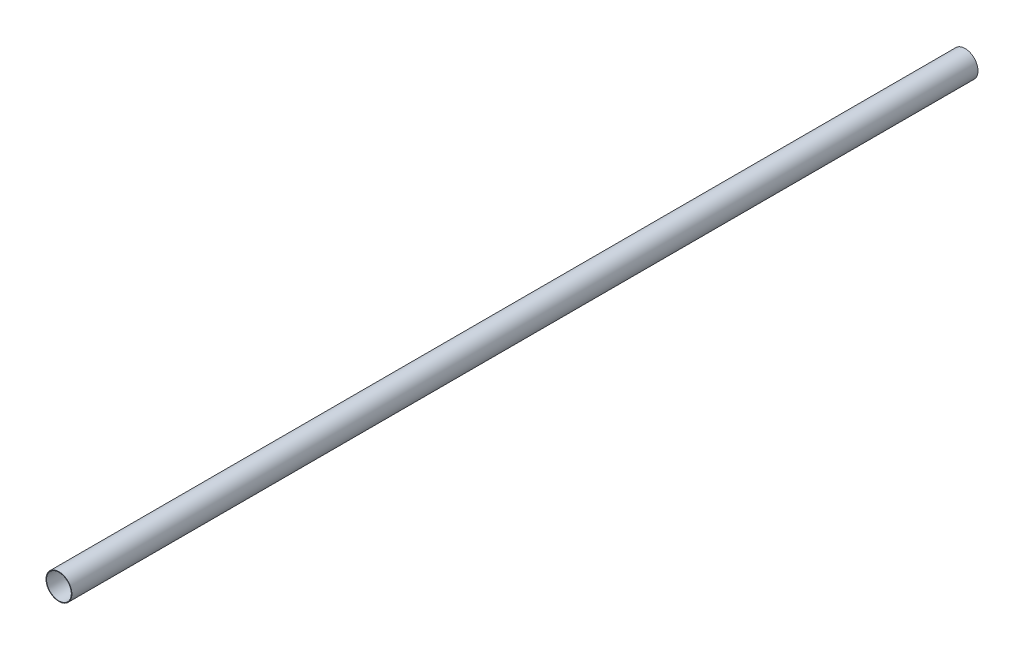
ISO-10303-21;
HEADER;
FILE_DESCRIPTION(('STEP AP214'),'2;1');
FILE_NAME('part.step','',(''),(''),'','','');
FILE_SCHEMA(('AUTOMOTIVE_DESIGN { 1 0 10303 214 1 1 1 1 }'));
ENDSEC;
DATA;
#1=APPLICATION_CONTEXT('core data for automotive mechanical design processes');
#2=APPLICATION_PROTOCOL_DEFINITION('international standard','automotive_design',2000,#1);
#3=PRODUCT_CONTEXT('',#1,'mechanical');
#4=PRODUCT('Part','Part','',(#3));
#5=PRODUCT_RELATED_PRODUCT_CATEGORY('part','',(#4));
#6=PRODUCT_DEFINITION_FORMATION('','',#4);
#7=PRODUCT_DEFINITION_CONTEXT('part definition',#1,'design');
#8=PRODUCT_DEFINITION('design','',#6,#7);
#9=PRODUCT_DEFINITION_SHAPE('','',#8);
#10=(LENGTH_UNIT() NAMED_UNIT(*) SI_UNIT(.MILLI.,.METRE.));
#11=(NAMED_UNIT(*) PLANE_ANGLE_UNIT() SI_UNIT($,.RADIAN.));
#12=(NAMED_UNIT(*) SI_UNIT($,.STERADIAN.) SOLID_ANGLE_UNIT());
#13=UNCERTAINTY_MEASURE_WITH_UNIT(LENGTH_MEASURE(1.E-05),#10,'distance_accuracy_value','');
#14=(GEOMETRIC_REPRESENTATION_CONTEXT(3) GLOBAL_UNCERTAINTY_ASSIGNED_CONTEXT((#13)) GLOBAL_UNIT_ASSIGNED_CONTEXT((#10,
#11,#12)) REPRESENTATION_CONTEXT('',''));
#15=CARTESIAN_POINT('',(0.,0.,0.));
#16=DIRECTION('',(0.,0.,1.));
#17=DIRECTION('',(1.,0.,0.));
#18=AXIS2_PLACEMENT_3D('',#15,#16,#17);
#19=CARTESIAN_POINT('',(0.,0.,1050.));
#20=DIRECTION('',(0.,0.,1.));
#21=DIRECTION('',(1.,0.,0.));
#22=AXIS2_PLACEMENT_3D('',#19,#20,#21);
#23=PLANE('',#22);
#24=CARTESIAN_POINT('',(0.,0.,1050.));
#25=DIRECTION('',(0.,0.,1.));
#26=DIRECTION('',(1.,0.,0.));
#27=AXIS2_PLACEMENT_3D('',#24,#25,#26);
#28=CIRCLE('',#27,15.);
#29=CARTESIAN_POINT('',(15.,0.,1050.));
#30=VERTEX_POINT('',#29);
#31=EDGE_CURVE('E10',#30,#30,#28,.T.);
#32=ORIENTED_EDGE('',*,*,#31,.T.);
#33=EDGE_LOOP('',(#32));
#34=FACE_BOUND('',#33,.T.);
#35=CARTESIAN_POINT('',(0.,0.,1050.));
#36=DIRECTION('',(0.,0.,1.));
#37=DIRECTION('',(1.,0.,0.));
#38=AXIS2_PLACEMENT_3D('',#35,#36,#37);
#39=CIRCLE('',#38,14.35);
#40=CARTESIAN_POINT('',(14.35,0.,1050.));
#41=VERTEX_POINT('',#40);
#42=EDGE_CURVE('E52',#41,#41,#39,.T.);
#43=ORIENTED_EDGE('',*,*,#42,.F.);
#44=EDGE_LOOP('',(#43));
#45=FACE_BOUND('',#44,.T.);
#46=ADVANCED_FACE('F39',(#34,#45),#23,.T.);
#47=CARTESIAN_POINT('',(0.,0.,0.));
#48=DIRECTION('',(0.,0.,1.));
#49=DIRECTION('',(1.,0.,0.));
#50=AXIS2_PLACEMENT_3D('',#47,#48,#49);
#51=PLANE('',#50);
#52=CARTESIAN_POINT('',(0.,0.,0.));
#53=DIRECTION('',(0.,0.,1.));
#54=DIRECTION('',(1.,0.,0.));
#55=AXIS2_PLACEMENT_3D('',#52,#53,#54);
#56=CIRCLE('',#55,15.);
#57=CARTESIAN_POINT('',(15.,0.,0.));
#58=VERTEX_POINT('',#57);
#59=EDGE_CURVE('E43',#58,#58,#56,.T.);
#60=ORIENTED_EDGE('',*,*,#59,.F.);
#61=EDGE_LOOP('',(#60));
#62=FACE_BOUND('',#61,.T.);
#63=CARTESIAN_POINT('',(0.,0.,0.));
#64=DIRECTION('',(0.,0.,1.));
#65=DIRECTION('',(1.,0.,0.));
#66=AXIS2_PLACEMENT_3D('',#63,#64,#65);
#67=CIRCLE('',#66,14.35);
#68=CARTESIAN_POINT('',(14.35,0.,0.));
#69=VERTEX_POINT('',#68);
#70=EDGE_CURVE('E54',#69,#69,#67,.T.);
#71=ORIENTED_EDGE('',*,*,#70,.T.);
#72=EDGE_LOOP('',(#71));
#73=FACE_BOUND('',#72,.T.);
#74=ADVANCED_FACE('F66',(#62,#73),#51,.F.);
#75=CARTESIAN_POINT('',(0.,0.,1050.));
#76=DIRECTION('',(0.,0.,-1.));
#77=DIRECTION('',(-1.,0.,0.));
#78=AXIS2_PLACEMENT_3D('',#75,#76,#77);
#79=CYLINDRICAL_SURFACE('',#78,15.);
#80=ORIENTED_EDGE('',*,*,#31,.F.);
#81=EDGE_LOOP('',(#80));
#82=FACE_BOUND('',#81,.T.);
#83=ORIENTED_EDGE('',*,*,#59,.T.);
#84=EDGE_LOOP('',(#83));
#85=FACE_BOUND('',#84,.T.);
#86=ADVANCED_FACE('F41',(#82,#85),#79,.T.);
#87=CARTESIAN_POINT('',(0.,0.,1050.));
#88=DIRECTION('',(0.,0.,-1.));
#89=DIRECTION('',(-1.,0.,0.));
#90=AXIS2_PLACEMENT_3D('',#87,#88,#89);
#91=CYLINDRICAL_SURFACE('',#90,14.35);
#92=ORIENTED_EDGE('',*,*,#42,.T.);
#93=EDGE_LOOP('',(#92));
#94=FACE_BOUND('',#93,.T.);
#95=ORIENTED_EDGE('',*,*,#70,.F.);
#96=EDGE_LOOP('',(#95));
#97=FACE_BOUND('',#96,.T.);
#98=ADVANCED_FACE('F62',(#94,#97),#91,.F.);
#99=CLOSED_SHELL('',(#46,#74,#86,#98));
#100=MANIFOLD_SOLID_BREP('B2',#99);
#101=ADVANCED_BREP_SHAPE_REPRESENTATION('',(#18,#100),#14);
#102=SHAPE_DEFINITION_REPRESENTATION(#9,#101);
ENDSEC;
END-ISO-10303-21;
